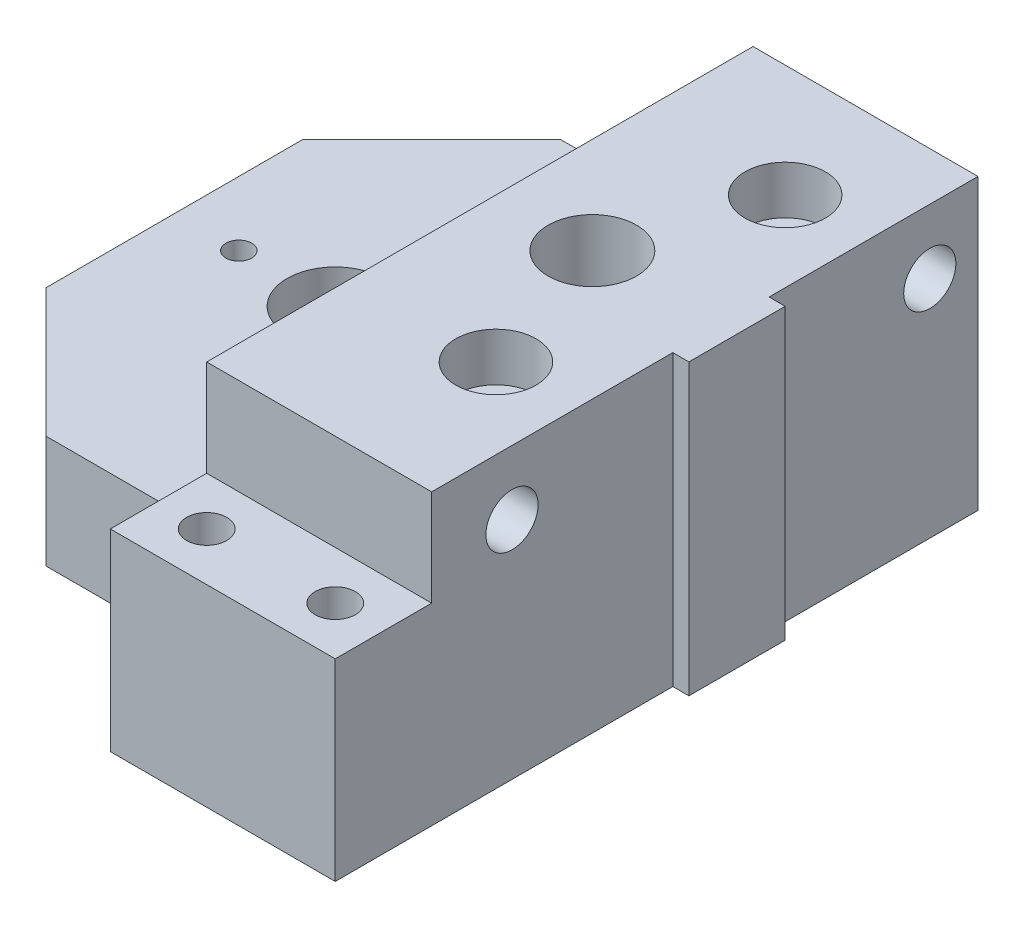
ISO-10303-21;
HEADER;
FILE_DESCRIPTION(('STEP AP214'),'2;1');
FILE_NAME('part.step','',(''),(''),'','','');
FILE_SCHEMA(('AUTOMOTIVE_DESIGN { 1 0 10303 214 1 1 1 1 }'));
ENDSEC;
DATA;
#1=APPLICATION_CONTEXT('core data for automotive mechanical design processes');
#2=APPLICATION_PROTOCOL_DEFINITION('international standard','automotive_design',2000,#1);
#3=PRODUCT_CONTEXT('',#1,'mechanical');
#4=PRODUCT('Part','Part','',(#3));
#5=PRODUCT_RELATED_PRODUCT_CATEGORY('part','',(#4));
#6=PRODUCT_DEFINITION_FORMATION('','',#4);
#7=PRODUCT_DEFINITION_CONTEXT('part definition',#1,'design');
#8=PRODUCT_DEFINITION('design','',#6,#7);
#9=PRODUCT_DEFINITION_SHAPE('','',#8);
#10=(LENGTH_UNIT() NAMED_UNIT(*) SI_UNIT(.MILLI.,.METRE.));
#11=(NAMED_UNIT(*) PLANE_ANGLE_UNIT() SI_UNIT($,.RADIAN.));
#12=(NAMED_UNIT(*) SI_UNIT($,.STERADIAN.) SOLID_ANGLE_UNIT());
#13=UNCERTAINTY_MEASURE_WITH_UNIT(LENGTH_MEASURE(1.E-05),#10,'distance_accuracy_value','');
#14=(GEOMETRIC_REPRESENTATION_CONTEXT(3) GLOBAL_UNCERTAINTY_ASSIGNED_CONTEXT((#13)) GLOBAL_UNIT_ASSIGNED_CONTEXT((#10,
#11,#12)) REPRESENTATION_CONTEXT('',''));
#15=CARTESIAN_POINT('',(0.,0.,0.));
#16=DIRECTION('',(0.,0.,1.));
#17=DIRECTION('',(1.,0.,0.));
#18=AXIS2_PLACEMENT_3D('',#15,#16,#17);
#19=CARTESIAN_POINT('',(60.325,-11.1125,-28.575));
#20=DIRECTION('',(0.,1.,0.));
#21=DIRECTION('',(0.,0.,1.));
#22=AXIS2_PLACEMENT_3D('',#19,#20,#21);
#23=CYLINDRICAL_SURFACE('',#22,5.15620000000001);
#24=CARTESIAN_POINT('',(60.325,-11.1125,-28.575));
#25=DIRECTION('',(0.,1.,0.));
#26=DIRECTION('',(0.,0.,1.));
#27=AXIS2_PLACEMENT_3D('',#24,#25,#26);
#28=CIRCLE('',#27,5.15620000000001);
#29=CARTESIAN_POINT('',(60.325,-11.1125,-23.4188));
#30=VERTEX_POINT('',#29);
#31=EDGE_CURVE('E255',#30,#30,#28,.T.);
#32=ORIENTED_EDGE('',*,*,#31,.F.);
#33=EDGE_LOOP('',(#32));
#34=FACE_BOUND('',#33,.T.);
#35=CARTESIAN_POINT('',(60.325,36.5125,-28.575));
#36=DIRECTION('',(0.,1.,0.));
#37=DIRECTION('',(0.,0.,1.));
#38=AXIS2_PLACEMENT_3D('',#35,#36,#37);
#39=CIRCLE('',#38,5.15620000000001);
#40=CARTESIAN_POINT('',(60.325,36.5125,-23.4188));
#41=VERTEX_POINT('',#40);
#42=EDGE_CURVE('E251',#41,#41,#39,.F.);
#43=ORIENTED_EDGE('',*,*,#42,.F.);
#44=EDGE_LOOP('',(#43));
#45=FACE_BOUND('',#44,.T.);
#46=ADVANCED_FACE('F39',(#34,#45),#23,.F.);
#47=CARTESIAN_POINT('',(60.325,-11.1125,28.575));
#48=DIRECTION('',(0.,1.,0.));
#49=DIRECTION('',(0.,0.,1.));
#50=AXIS2_PLACEMENT_3D('',#47,#48,#49);
#51=CYLINDRICAL_SURFACE('',#50,5.15620000000001);
#52=CARTESIAN_POINT('',(60.325,-11.1125,28.575));
#53=DIRECTION('',(0.,1.,0.));
#54=DIRECTION('',(0.,0.,1.));
#55=AXIS2_PLACEMENT_3D('',#52,#53,#54);
#56=CIRCLE('',#55,5.15620000000001);
#57=CARTESIAN_POINT('',(60.325,-11.1125,33.7312));
#58=VERTEX_POINT('',#57);
#59=EDGE_CURVE('E292',#58,#58,#56,.T.);
#60=ORIENTED_EDGE('',*,*,#59,.F.);
#61=EDGE_LOOP('',(#60));
#62=FACE_BOUND('',#61,.T.);
#63=CARTESIAN_POINT('',(60.325,36.5125,28.575));
#64=DIRECTION('',(0.,1.,0.));
#65=DIRECTION('',(0.,0.,1.));
#66=AXIS2_PLACEMENT_3D('',#63,#64,#65);
#67=CIRCLE('',#66,5.15620000000001);
#68=CARTESIAN_POINT('',(60.325,36.5125,33.7312));
#69=VERTEX_POINT('',#68);
#70=EDGE_CURVE('E248',#69,#69,#67,.F.);
#71=ORIENTED_EDGE('',*,*,#70,.F.);
#72=EDGE_LOOP('',(#71));
#73=FACE_BOUND('',#72,.T.);
#74=ADVANCED_FACE('F418',(#62,#73),#51,.F.);
#75=CARTESIAN_POINT('',(76.2,26.9875,76.2));
#76=DIRECTION('',(-1.,0.,0.));
#77=DIRECTION('',(0.,0.,1.));
#78=AXIS2_PLACEMENT_3D('',#75,#76,#77);
#79=PLANE('',#78);
#80=CARTESIAN_POINT('',(76.2,33.3375,41.275));
#81=DIRECTION('',(-1.,0.,0.));
#82=DIRECTION('',(0.,0.,1.));
#83=AXIS2_PLACEMENT_3D('',#80,#81,#82);
#84=CIRCLE('',#83,5.1562);
#85=CARTESIAN_POINT('',(76.2,33.3375,46.4312));
#86=VERTEX_POINT('',#85);
#87=EDGE_CURVE('E258',#86,#86,#84,.F.);
#88=ORIENTED_EDGE('',*,*,#87,.F.);
#89=EDGE_LOOP('',(#88));
#90=FACE_BOUND('',#89,.T.);
#91=DIRECTION('',(0.,-1.,0.));
#92=VECTOR('',#91,1.);
#93=CARTESIAN_POINT('',(76.2,46.0375,9.4996));
#94=LINE('',#93,#92);
#95=CARTESIAN_POINT('',(76.2,46.0375,9.4996));
#96=VERTEX_POINT('',#95);
#97=CARTESIAN_POINT('',(76.2,-11.1125,9.4996));
#98=VERTEX_POINT('',#97);
#99=EDGE_CURVE('E153',#96,#98,#94,.T.);
#100=ORIENTED_EDGE('',*,*,#99,.F.);
#101=DIRECTION('',(0.,0.,-1.));
#102=VECTOR('',#101,1.);
#103=CARTESIAN_POINT('',(76.2,46.0375,57.15));
#104=LINE('',#103,#102);
#105=CARTESIAN_POINT('',(76.2,46.0375,57.15));
#106=VERTEX_POINT('',#105);
#107=EDGE_CURVE('E166',#106,#96,#104,.T.);
#108=ORIENTED_EDGE('',*,*,#107,.F.);
#109=DIRECTION('',(0.,-1.,0.));
#110=VECTOR('',#109,1.);
#111=CARTESIAN_POINT('',(76.2,46.0375,57.15));
#112=LINE('',#111,#110);
#113=CARTESIAN_POINT('',(76.2,26.9875,57.15));
#114=VERTEX_POINT('',#113);
#115=EDGE_CURVE('E179',#106,#114,#112,.T.);
#116=ORIENTED_EDGE('',*,*,#115,.T.);
#117=DIRECTION('',(0.,0.,-1.));
#118=VECTOR('',#117,1.);
#119=CARTESIAN_POINT('',(76.2,26.9875,76.2));
#120=LINE('',#119,#118);
#121=CARTESIAN_POINT('',(76.2,26.9875,76.2));
#122=VERTEX_POINT('',#121);
#123=EDGE_CURVE('E195',#122,#114,#120,.T.);
#124=ORIENTED_EDGE('',*,*,#123,.F.);
#125=DIRECTION('',(0.,-1.,0.));
#126=VECTOR('',#125,1.);
#127=CARTESIAN_POINT('',(76.2,26.9875,76.2));
#128=LINE('',#127,#126);
#129=CARTESIAN_POINT('',(76.2,-11.1125,76.2));
#130=VERTEX_POINT('',#129);
#131=EDGE_CURVE('E208',#122,#130,#128,.T.);
#132=ORIENTED_EDGE('',*,*,#131,.T.);
#133=DIRECTION('',(0.,0.,-1.));
#134=VECTOR('',#133,1.);
#135=CARTESIAN_POINT('',(76.2,-11.1125,76.2));
#136=LINE('',#135,#134);
#137=EDGE_CURVE('E169',#130,#98,#136,.T.);
#138=ORIENTED_EDGE('',*,*,#137,.T.);
#139=EDGE_LOOP('',(#100,#108,#116,#124,#132,#138));
#140=FACE_BOUND('',#139,.T.);
#141=ADVANCED_FACE('F164',(#90,#140),#79,.F.);
#142=CARTESIAN_POINT('',(0.,26.9875,0.));
#143=DIRECTION('',(0.,-1.,0.));
#144=DIRECTION('',(0.,0.,-1.));
#145=AXIS2_PLACEMENT_3D('',#142,#143,#144);
#146=PLANE('',#145);
#147=CARTESIAN_POINT('',(41.275,26.9875,66.675));
#148=DIRECTION('',(0.,1.,0.));
#149=DIRECTION('',(0.,0.,1.));
#150=AXIS2_PLACEMENT_3D('',#147,#148,#149);
#151=CIRCLE('',#150,3.96875);
#152=CARTESIAN_POINT('',(41.275,26.9875,70.64375));
#153=VERTEX_POINT('',#152);
#154=EDGE_CURVE('E302',#153,#153,#151,.T.);
#155=ORIENTED_EDGE('',*,*,#154,.F.);
#156=EDGE_LOOP('',(#155));
#157=FACE_BOUND('',#156,.T.);
#158=CARTESIAN_POINT('',(66.675,26.9875,66.675));
#159=DIRECTION('',(0.,1.,0.));
#160=DIRECTION('',(0.,0.,1.));
#161=AXIS2_PLACEMENT_3D('',#158,#159,#160);
#162=CIRCLE('',#161,3.96875000000001);
#163=CARTESIAN_POINT('',(66.675,26.9875,70.64375));
#164=VERTEX_POINT('',#163);
#165=EDGE_CURVE('E305',#164,#164,#162,.T.);
#166=ORIENTED_EDGE('',*,*,#165,.F.);
#167=EDGE_LOOP('',(#166));
#168=FACE_BOUND('',#167,.T.);
#169=DIRECTION('',(1.,0.,0.));
#170=VECTOR('',#169,1.);
#171=CARTESIAN_POINT('',(31.75,26.9875,57.15));
#172=LINE('',#171,#170);
#173=CARTESIAN_POINT('',(31.75,26.9875,57.15));
#174=VERTEX_POINT('',#173);
#175=EDGE_CURVE('E64',#174,#114,#172,.T.);
#176=ORIENTED_EDGE('',*,*,#175,.F.);
#177=DIRECTION('',(0.,0.,1.));
#178=VECTOR('',#177,1.);
#179=CARTESIAN_POINT('',(31.75,26.9875,76.2));
#180=LINE('',#179,#178);
#181=CARTESIAN_POINT('',(31.75,26.9875,76.2));
#182=VERTEX_POINT('',#181);
#183=EDGE_CURVE('E191',#174,#182,#180,.T.);
#184=ORIENTED_EDGE('',*,*,#183,.T.);
#185=DIRECTION('',(1.,0.,0.));
#186=VECTOR('',#185,1.);
#187=CARTESIAN_POINT('',(31.75,26.9875,76.2));
#188=LINE('',#187,#186);
#189=EDGE_CURVE('E193',#182,#122,#188,.T.);
#190=ORIENTED_EDGE('',*,*,#189,.T.);
#191=ORIENTED_EDGE('',*,*,#123,.T.);
#192=EDGE_LOOP('',(#176,#184,#190,#191));
#193=FACE_BOUND('',#192,.T.);
#194=ADVANCED_FACE('F362',(#157,#168,#193),#146,.F.);
#195=CARTESIAN_POINT('',(-31.75,11.1125,-25.4));
#196=DIRECTION('',(1.,0.,0.));
#197=DIRECTION('',(0.,0.,-1.));
#198=AXIS2_PLACEMENT_3D('',#195,#196,#197);
#199=PLANE('',#198);
#200=DIRECTION('',(0.,0.,1.));
#201=VECTOR('',#200,1.);
#202=CARTESIAN_POINT('',(-31.75,-11.1125,-25.4));
#203=LINE('',#202,#201);
#204=CARTESIAN_POINT('',(-31.75,-11.1125,-25.4));
#205=VERTEX_POINT('',#204);
#206=CARTESIAN_POINT('',(-31.75,-11.1125,25.4));
#207=VERTEX_POINT('',#206);
#208=EDGE_CURVE('E213',#205,#207,#203,.T.);
#209=ORIENTED_EDGE('',*,*,#208,.T.);
#210=DIRECTION('',(0.,-1.,0.));
#211=VECTOR('',#210,1.);
#212=CARTESIAN_POINT('',(-31.75,11.1125,25.4));
#213=LINE('',#212,#211);
#214=CARTESIAN_POINT('',(-31.75,11.1125,25.4));
#215=VERTEX_POINT('',#214);
#216=EDGE_CURVE('E11',#215,#207,#213,.T.);
#217=ORIENTED_EDGE('',*,*,#216,.F.);
#218=DIRECTION('',(0.,0.,1.));
#219=VECTOR('',#218,1.);
#220=CARTESIAN_POINT('',(-31.75,11.1125,-25.4));
#221=LINE('',#220,#219);
#222=CARTESIAN_POINT('',(-31.75,11.1125,-25.4));
#223=VERTEX_POINT('',#222);
#224=EDGE_CURVE('E214',#223,#215,#221,.T.);
#225=ORIENTED_EDGE('',*,*,#224,.F.);
#226=DIRECTION('',(0.,-1.,0.));
#227=VECTOR('',#226,1.);
#228=CARTESIAN_POINT('',(-31.75,11.1125,-25.4));
#229=LINE('',#228,#227);
#230=EDGE_CURVE('E228',#223,#205,#229,.T.);
#231=ORIENTED_EDGE('',*,*,#230,.T.);
#232=EDGE_LOOP('',(#209,#217,#225,#231));
#233=FACE_BOUND('',#232,.T.);
#234=ADVANCED_FACE('F41',(#233),#199,.F.);
#235=CARTESIAN_POINT('',(-31.75,11.1125,25.4));
#236=DIRECTION('',(0.707106781186547,0.,-0.707106781186547));
#237=DIRECTION('',(-0.707106781186548,0.,-0.707106781186548));
#238=AXIS2_PLACEMENT_3D('',#235,#236,#237);
#239=PLANE('',#238);
#240=DIRECTION('',(0.707106781186547,0.,0.707106781186547));
#241=VECTOR('',#240,1.);
#242=CARTESIAN_POINT('',(-31.75,-11.1125,25.4));
#243=LINE('',#242,#241);
#244=CARTESIAN_POINT('',(-6.35,-11.1125,50.8));
#245=VERTEX_POINT('',#244);
#246=EDGE_CURVE('E231',#207,#245,#243,.T.);
#247=ORIENTED_EDGE('',*,*,#246,.T.);
#248=DIRECTION('',(0.,-1.,0.));
#249=VECTOR('',#248,1.);
#250=CARTESIAN_POINT('',(-6.35,11.1125,50.8));
#251=LINE('',#250,#249);
#252=CARTESIAN_POINT('',(-6.35,11.1125,50.8));
#253=VERTEX_POINT('',#252);
#254=EDGE_CURVE('E48',#253,#245,#251,.T.);
#255=ORIENTED_EDGE('',*,*,#254,.F.);
#256=DIRECTION('',(0.707106781186547,0.,0.707106781186547));
#257=VECTOR('',#256,1.);
#258=CARTESIAN_POINT('',(-31.75,11.1125,25.4));
#259=LINE('',#258,#257);
#260=EDGE_CURVE('E217',#215,#253,#259,.T.);
#261=ORIENTED_EDGE('',*,*,#260,.F.);
#262=ORIENTED_EDGE('',*,*,#216,.T.);
#263=EDGE_LOOP('',(#247,#255,#261,#262));
#264=FACE_BOUND('',#263,.T.);
#265=ADVANCED_FACE('F398',(#264),#239,.F.);
#266=CARTESIAN_POINT('',(-6.35,11.1125,50.8));
#267=DIRECTION('',(0.,0.,-1.));
#268=DIRECTION('',(-1.,0.,0.));
#269=AXIS2_PLACEMENT_3D('',#266,#267,#268);
#270=PLANE('',#269);
#271=DIRECTION('',(1.,0.,0.));
#272=VECTOR('',#271,1.);
#273=CARTESIAN_POINT('',(-6.35,-11.1125,50.8));
#274=LINE('',#273,#272);
#275=CARTESIAN_POINT('',(31.75,-11.1125,50.8));
#276=VERTEX_POINT('',#275);
#277=EDGE_CURVE('E233',#245,#276,#274,.T.);
#278=ORIENTED_EDGE('',*,*,#277,.T.);
#279=DIRECTION('',(0.,-1.,0.));
#280=VECTOR('',#279,1.);
#281=CARTESIAN_POINT('',(31.75,11.1125,50.8));
#282=LINE('',#281,#280);
#283=CARTESIAN_POINT('',(31.75,11.1125,50.8));
#284=VERTEX_POINT('',#283);
#285=EDGE_CURVE('E243',#284,#276,#282,.T.);
#286=ORIENTED_EDGE('',*,*,#285,.F.);
#287=DIRECTION('',(1.,0.,0.));
#288=VECTOR('',#287,1.);
#289=CARTESIAN_POINT('',(-6.35,11.1125,50.8));
#290=LINE('',#289,#288);
#291=EDGE_CURVE('E220',#253,#284,#290,.T.);
#292=ORIENTED_EDGE('',*,*,#291,.F.);
#293=ORIENTED_EDGE('',*,*,#254,.T.);
#294=EDGE_LOOP('',(#278,#286,#292,#293));
#295=FACE_BOUND('',#294,.T.);
#296=ADVANCED_FACE('F394',(#295),#270,.F.);
#297=CARTESIAN_POINT('',(31.75,11.1125,-50.8));
#298=DIRECTION('',(0.,0.,1.));
#299=DIRECTION('',(1.,0.,0.));
#300=AXIS2_PLACEMENT_3D('',#297,#298,#299);
#301=PLANE('',#300);
#302=DIRECTION('',(-1.,0.,0.));
#303=VECTOR('',#302,1.);
#304=CARTESIAN_POINT('',(31.75,-11.1125,-50.8));
#305=LINE('',#304,#303);
#306=CARTESIAN_POINT('',(76.2,-11.1125,-50.8));
#307=VERTEX_POINT('',#306);
#308=CARTESIAN_POINT('',(-6.35,-11.1125,-50.8));
#309=VERTEX_POINT('',#308);
#310=EDGE_CURVE('E235',#307,#309,#305,.T.);
#311=ORIENTED_EDGE('',*,*,#310,.T.);
#312=DIRECTION('',(0.,-1.,0.));
#313=VECTOR('',#312,1.);
#314=CARTESIAN_POINT('',(-6.35,11.1125,-50.8));
#315=LINE('',#314,#313);
#316=CARTESIAN_POINT('',(-6.35,11.1125,-50.8));
#317=VERTEX_POINT('',#316);
#318=EDGE_CURVE('E240',#317,#309,#315,.T.);
#319=ORIENTED_EDGE('',*,*,#318,.F.);
#320=DIRECTION('',(-1.,0.,0.));
#321=VECTOR('',#320,1.);
#322=CARTESIAN_POINT('',(31.75,11.1125,-50.8));
#323=LINE('',#322,#321);
#324=CARTESIAN_POINT('',(31.75,11.1125,-50.8));
#325=VERTEX_POINT('',#324);
#326=EDGE_CURVE('E224',#325,#317,#323,.T.);
#327=ORIENTED_EDGE('',*,*,#326,.F.);
#328=DIRECTION('',(0.,-1.,0.));
#329=VECTOR('',#328,1.);
#330=CARTESIAN_POINT('',(31.75,26.9875,-50.8));
#331=LINE('',#330,#329);
#332=CARTESIAN_POINT('',(31.75,46.0375,-50.8));
#333=VERTEX_POINT('',#332);
#334=EDGE_CURVE('E197',#333,#325,#331,.T.);
#335=ORIENTED_EDGE('',*,*,#334,.F.);
#336=DIRECTION('',(-1.,0.,0.));
#337=VECTOR('',#336,1.);
#338=CARTESIAN_POINT('',(31.75,46.0375,-50.8));
#339=LINE('',#338,#337);
#340=CARTESIAN_POINT('',(76.2,46.0375,-50.8));
#341=VERTEX_POINT('',#340);
#342=EDGE_CURVE('E175',#341,#333,#339,.T.);
#343=ORIENTED_EDGE('',*,*,#342,.F.);
#344=DIRECTION('',(0.,-1.,0.));
#345=VECTOR('',#344,1.);
#346=CARTESIAN_POINT('',(76.2,26.9875,-50.8));
#347=LINE('',#346,#345);
#348=EDGE_CURVE('E205',#341,#307,#347,.T.);
#349=ORIENTED_EDGE('',*,*,#348,.T.);
#350=EDGE_LOOP('',(#311,#319,#327,#335,#343,#349));
#351=FACE_BOUND('',#350,.T.);
#352=ADVANCED_FACE('F385',(#351),#301,.F.);
#353=CARTESIAN_POINT('',(-6.35,11.1125,-50.8));
#354=DIRECTION('',(0.707106781186547,0.,0.707106781186547));
#355=DIRECTION('',(0.707106781186548,0.,-0.707106781186548));
#356=AXIS2_PLACEMENT_3D('',#353,#354,#355);
#357=PLANE('',#356);
#358=DIRECTION('',(-0.707106781186547,0.,0.707106781186547));
#359=VECTOR('',#358,1.);
#360=CARTESIAN_POINT('',(-6.35,-11.1125,-50.8));
#361=LINE('',#360,#359);
#362=EDGE_CURVE('E218',#309,#205,#361,.T.);
#363=ORIENTED_EDGE('',*,*,#362,.T.);
#364=ORIENTED_EDGE('',*,*,#230,.F.);
#365=DIRECTION('',(-0.707106781186547,0.,0.707106781186547));
#366=VECTOR('',#365,1.);
#367=CARTESIAN_POINT('',(-6.35,11.1125,-50.8));
#368=LINE('',#367,#366);
#369=EDGE_CURVE('E226',#317,#223,#368,.T.);
#370=ORIENTED_EDGE('',*,*,#369,.F.);
#371=ORIENTED_EDGE('',*,*,#318,.T.);
#372=EDGE_LOOP('',(#363,#364,#370,#371));
#373=FACE_BOUND('',#372,.T.);
#374=ADVANCED_FACE('F404',(#373),#357,.F.);
#375=CARTESIAN_POINT('',(0.,11.1125,0.));
#376=DIRECTION('',(0.,1.,0.));
#377=DIRECTION('',(0.,0.,1.));
#378=AXIS2_PLACEMENT_3D('',#375,#376,#377);
#379=PLANE('',#378);
#380=CARTESIAN_POINT('',(9.525,11.1125,-16.51));
#381=DIRECTION('',(0.,1.,0.));
#382=DIRECTION('',(0.,0.,1.));
#383=AXIS2_PLACEMENT_3D('',#380,#381,#382);
#384=CIRCLE('',#383,2.5527);
#385=CARTESIAN_POINT('',(9.525,11.1125,-13.9573));
#386=VERTEX_POINT('',#385);
#387=EDGE_CURVE('E313',#386,#386,#384,.T.);
#388=ORIENTED_EDGE('',*,*,#387,.F.);
#389=EDGE_LOOP('',(#388));
#390=FACE_BOUND('',#389,.T.);
#391=CARTESIAN_POINT('',(-19.05,11.1125,0.));
#392=DIRECTION('',(0.,1.,0.));
#393=DIRECTION('',(0.,0.,1.));
#394=AXIS2_PLACEMENT_3D('',#391,#392,#393);
#395=CIRCLE('',#394,2.5527);
#396=CARTESIAN_POINT('',(-19.05,11.1125,2.5527));
#397=VERTEX_POINT('',#396);
#398=EDGE_CURVE('E326',#397,#397,#395,.T.);
#399=ORIENTED_EDGE('',*,*,#398,.F.);
#400=EDGE_LOOP('',(#399));
#401=FACE_BOUND('',#400,.T.);
#402=CARTESIAN_POINT('',(9.525,11.1125,16.51));
#403=DIRECTION('',(0.,1.,0.));
#404=DIRECTION('',(0.,0.,1.));
#405=AXIS2_PLACEMENT_3D('',#402,#403,#404);
#406=CIRCLE('',#405,2.5527);
#407=CARTESIAN_POINT('',(9.525,11.1125,19.0627));
#408=VERTEX_POINT('',#407);
#409=EDGE_CURVE('E329',#408,#408,#406,.T.);
#410=ORIENTED_EDGE('',*,*,#409,.F.);
#411=EDGE_LOOP('',(#410));
#412=FACE_BOUND('',#411,.T.);
#413=CARTESIAN_POINT('',(0.,11.1125,0.));
#414=DIRECTION('',(0.,1.,0.));
#415=DIRECTION('',(0.,0.,1.));
#416=AXIS2_PLACEMENT_3D('',#413,#414,#415);
#417=CIRCLE('',#416,9.525);
#418=CARTESIAN_POINT('',(0.,11.1125,9.525));
#419=VERTEX_POINT('',#418);
#420=EDGE_CURVE('E325',#419,#419,#417,.T.);
#421=ORIENTED_EDGE('',*,*,#420,.F.);
#422=EDGE_LOOP('',(#421));
#423=FACE_BOUND('',#422,.T.);
#424=ORIENTED_EDGE('',*,*,#224,.T.);
#425=ORIENTED_EDGE('',*,*,#260,.T.);
#426=ORIENTED_EDGE('',*,*,#291,.T.);
#427=DIRECTION('',(0.,0.,-1.));
#428=VECTOR('',#427,1.);
#429=CARTESIAN_POINT('',(31.75,11.1125,50.8));
#430=LINE('',#429,#428);
#431=EDGE_CURVE('E222',#284,#325,#430,.T.);
#432=ORIENTED_EDGE('',*,*,#431,.T.);
#433=ORIENTED_EDGE('',*,*,#326,.T.);
#434=ORIENTED_EDGE('',*,*,#369,.T.);
#435=EDGE_LOOP('',(#424,#425,#426,#432,#433,#434));
#436=FACE_BOUND('',#435,.T.);
#437=ADVANCED_FACE('F390',(#390,#401,#412,#423,#436),#379,.T.);
#438=CARTESIAN_POINT('',(0.,-11.1125,0.));
#439=DIRECTION('',(0.,1.,0.));
#440=DIRECTION('',(0.,0.,1.));
#441=AXIS2_PLACEMENT_3D('',#438,#439,#440);
#442=PLANE('',#441);
#443=ORIENTED_EDGE('',*,*,#59,.T.);
#444=EDGE_LOOP('',(#443));
#445=FACE_BOUND('',#444,.T.);
#446=ORIENTED_EDGE('',*,*,#31,.T.);
#447=EDGE_LOOP('',(#446));
#448=FACE_BOUND('',#447,.T.);
#449=CARTESIAN_POINT('',(0.,-11.1125,0.));
#450=DIRECTION('',(0.,1.,0.));
#451=DIRECTION('',(0.,0.,1.));
#452=AXIS2_PLACEMENT_3D('',#449,#450,#451);
#453=CIRCLE('',#452,9.525);
#454=CARTESIAN_POINT('',(0.,-11.1125,9.525));
#455=VERTEX_POINT('',#454);
#456=EDGE_CURVE('E334',#455,#455,#453,.T.);
#457=ORIENTED_EDGE('',*,*,#456,.T.);
#458=EDGE_LOOP('',(#457));
#459=FACE_BOUND('',#458,.T.);
#460=ORIENTED_EDGE('',*,*,#208,.F.);
#461=ORIENTED_EDGE('',*,*,#362,.F.);
#462=ORIENTED_EDGE('',*,*,#310,.F.);
#463=CARTESIAN_POINT('',(76.2,-11.1125,-9.52500000000001));
#464=VERTEX_POINT('',#463);
#465=EDGE_CURVE('E201',#464,#307,#136,.T.);
#466=ORIENTED_EDGE('',*,*,#465,.F.);
#467=DIRECTION('',(-1.,0.,0.));
#468=VECTOR('',#467,1.);
#469=CARTESIAN_POINT('',(76.2,-11.1125,-9.525));
#470=LINE('',#469,#468);
#471=CARTESIAN_POINT('',(79.375,-11.1125,-9.525));
#472=VERTEX_POINT('',#471);
#473=EDGE_CURVE('E56',#472,#464,#470,.T.);
#474=ORIENTED_EDGE('',*,*,#473,.F.);
#475=DIRECTION('',(0.,0.,-1.));
#476=VECTOR('',#475,1.);
#477=CARTESIAN_POINT('',(79.375,-11.1125,9.4996));
#478=LINE('',#477,#476);
#479=CARTESIAN_POINT('',(79.375,-11.1125,9.4996));
#480=VERTEX_POINT('',#479);
#481=EDGE_CURVE('E345',#480,#472,#478,.T.);
#482=ORIENTED_EDGE('',*,*,#481,.F.);
#483=DIRECTION('',(1.,0.,0.));
#484=VECTOR('',#483,1.);
#485=CARTESIAN_POINT('',(76.2,-11.1125,9.4996));
#486=LINE('',#485,#484);
#487=EDGE_CURVE('E337',#98,#480,#486,.T.);
#488=ORIENTED_EDGE('',*,*,#487,.F.);
#489=ORIENTED_EDGE('',*,*,#137,.F.);
#490=DIRECTION('',(1.,0.,0.));
#491=VECTOR('',#490,1.);
#492=CARTESIAN_POINT('',(31.75,-11.1125,76.2));
#493=LINE('',#492,#491);
#494=CARTESIAN_POINT('',(31.75,-11.1125,76.2));
#495=VERTEX_POINT('',#494);
#496=EDGE_CURVE('E199',#495,#130,#493,.T.);
#497=ORIENTED_EDGE('',*,*,#496,.F.);
#498=DIRECTION('',(0.,0.,1.));
#499=VECTOR('',#498,1.);
#500=CARTESIAN_POINT('',(31.75,-11.1125,76.2));
#501=LINE('',#500,#499);
#502=EDGE_CURVE('E190',#276,#495,#501,.T.);
#503=ORIENTED_EDGE('',*,*,#502,.F.);
#504=ORIENTED_EDGE('',*,*,#277,.F.);
#505=ORIENTED_EDGE('',*,*,#246,.F.);
#506=EDGE_LOOP('',(#460,#461,#462,#466,#474,#482,#488,#489,#497,#503,#504,#505));
#507=FACE_BOUND('',#506,.T.);
#508=ADVANCED_FACE('F370',(#445,#448,#459,#507),#442,.F.);
#509=CARTESIAN_POINT('',(31.75,26.9875,76.2));
#510=DIRECTION('',(1.,0.,0.));
#511=DIRECTION('',(0.,0.,-1.));
#512=AXIS2_PLACEMENT_3D('',#509,#510,#511);
#513=PLANE('',#512);
#514=CARTESIAN_POINT('',(31.75,33.3375,41.275));
#515=DIRECTION('',(1.,0.,0.));
#516=DIRECTION('',(0.,0.,-1.));
#517=AXIS2_PLACEMENT_3D('',#514,#515,#516);
#518=CIRCLE('',#517,7.9375);
#519=CARTESIAN_POINT('',(31.75,33.3375,33.3375));
#520=VERTEX_POINT('',#519);
#521=EDGE_CURVE('E266',#520,#520,#518,.T.);
#522=ORIENTED_EDGE('',*,*,#521,.T.);
#523=EDGE_LOOP('',(#522));
#524=FACE_BOUND('',#523,.T.);
#525=CARTESIAN_POINT('',(31.75,33.3375,-41.275));
#526=DIRECTION('',(1.,0.,0.));
#527=DIRECTION('',(0.,0.,-1.));
#528=AXIS2_PLACEMENT_3D('',#525,#526,#527);
#529=CIRCLE('',#528,7.9375);
#530=CARTESIAN_POINT('',(31.75,33.3375,-49.2125));
#531=VERTEX_POINT('',#530);
#532=EDGE_CURVE('E271',#531,#531,#529,.T.);
#533=ORIENTED_EDGE('',*,*,#532,.T.);
#534=EDGE_LOOP('',(#533));
#535=FACE_BOUND('',#534,.T.);
#536=ORIENTED_EDGE('',*,*,#431,.F.);
#537=ORIENTED_EDGE('',*,*,#285,.T.);
#538=ORIENTED_EDGE('',*,*,#502,.T.);
#539=DIRECTION('',(0.,-1.,0.));
#540=VECTOR('',#539,1.);
#541=CARTESIAN_POINT('',(31.75,26.9875,76.2));
#542=LINE('',#541,#540);
#543=EDGE_CURVE('E210',#182,#495,#542,.T.);
#544=ORIENTED_EDGE('',*,*,#543,.F.);
#545=ORIENTED_EDGE('',*,*,#183,.F.);
#546=DIRECTION('',(0.,-1.,0.));
#547=VECTOR('',#546,1.);
#548=CARTESIAN_POINT('',(31.75,46.0375,57.15));
#549=LINE('',#548,#547);
#550=CARTESIAN_POINT('',(31.75,46.0375,57.15));
#551=VERTEX_POINT('',#550);
#552=EDGE_CURVE('E187',#551,#174,#549,.T.);
#553=ORIENTED_EDGE('',*,*,#552,.F.);
#554=DIRECTION('',(0.,0.,1.));
#555=VECTOR('',#554,1.);
#556=CARTESIAN_POINT('',(31.75,46.0375,57.15));
#557=LINE('',#556,#555);
#558=EDGE_CURVE('E185',#333,#551,#557,.T.);
#559=ORIENTED_EDGE('',*,*,#558,.F.);
#560=ORIENTED_EDGE('',*,*,#334,.T.);
#561=EDGE_LOOP('',(#536,#537,#538,#544,#545,#553,#559,#560));
#562=FACE_BOUND('',#561,.T.);
#563=ADVANCED_FACE('F356',(#524,#535,#562),#513,.F.);
#564=CARTESIAN_POINT('',(31.75,26.9875,76.2));
#565=DIRECTION('',(0.,0.,-1.));
#566=DIRECTION('',(-1.,0.,0.));
#567=AXIS2_PLACEMENT_3D('',#564,#565,#566);
#568=PLANE('',#567);
#569=ORIENTED_EDGE('',*,*,#496,.T.);
#570=ORIENTED_EDGE('',*,*,#131,.F.);
#571=ORIENTED_EDGE('',*,*,#189,.F.);
#572=ORIENTED_EDGE('',*,*,#543,.T.);
#573=EDGE_LOOP('',(#569,#570,#571,#572));
#574=FACE_BOUND('',#573,.T.);
#575=ADVANCED_FACE('F365',(#574),#568,.F.);
#576=CARTESIAN_POINT('',(76.2,33.3375,-41.275));
#577=DIRECTION('',(-1.,0.,0.));
#578=DIRECTION('',(0.,0.,1.));
#579=AXIS2_PLACEMENT_3D('',#576,#577,#578);
#580=CIRCLE('',#579,5.1562);
#581=CARTESIAN_POINT('',(76.2,33.3375,-36.1188));
#582=VERTEX_POINT('',#581);
#583=EDGE_CURVE('E256',#582,#582,#580,.F.);
#584=ORIENTED_EDGE('',*,*,#583,.F.);
#585=EDGE_LOOP('',(#584));
#586=FACE_BOUND('',#585,.T.);
#587=CARTESIAN_POINT('',(76.2,46.0375,-9.525));
#588=VERTEX_POINT('',#587);
#589=EDGE_CURVE('E176',#588,#341,#104,.T.);
#590=ORIENTED_EDGE('',*,*,#589,.F.);
#591=DIRECTION('',(0.,-1.,0.));
#592=VECTOR('',#591,1.);
#593=CARTESIAN_POINT('',(76.2,46.0375,-9.525));
#594=LINE('',#593,#592);
#595=EDGE_CURVE('E343',#588,#464,#594,.T.);
#596=ORIENTED_EDGE('',*,*,#595,.T.);
#597=ORIENTED_EDGE('',*,*,#465,.T.);
#598=ORIENTED_EDGE('',*,*,#348,.F.);
#599=EDGE_LOOP('',(#590,#596,#597,#598));
#600=FACE_BOUND('',#599,.T.);
#601=ADVANCED_FACE('F382',(#586,#600),#79,.F.);
#602=CARTESIAN_POINT('',(31.75,46.0375,57.15));
#603=DIRECTION('',(0.,0.,-1.));
#604=DIRECTION('',(-1.,0.,0.));
#605=AXIS2_PLACEMENT_3D('',#602,#603,#604);
#606=PLANE('',#605);
#607=ORIENTED_EDGE('',*,*,#175,.T.);
#608=ORIENTED_EDGE('',*,*,#115,.F.);
#609=DIRECTION('',(1.,0.,0.));
#610=VECTOR('',#609,1.);
#611=CARTESIAN_POINT('',(31.75,46.0375,57.15));
#612=LINE('',#611,#610);
#613=EDGE_CURVE('E173',#551,#106,#612,.T.);
#614=ORIENTED_EDGE('',*,*,#613,.F.);
#615=ORIENTED_EDGE('',*,*,#552,.T.);
#616=EDGE_LOOP('',(#607,#608,#614,#615));
#617=FACE_BOUND('',#616,.T.);
#618=ADVANCED_FACE('F359',(#617),#606,.F.);
#619=CARTESIAN_POINT('',(0.,46.0375,0.));
#620=DIRECTION('',(0.,-1.,0.));
#621=DIRECTION('',(0.,0.,-1.));
#622=AXIS2_PLACEMENT_3D('',#619,#620,#621);
#623=PLANE('',#622);
#624=CARTESIAN_POINT('',(60.325,46.0375,28.575));
#625=DIRECTION('',(0.,1.,0.));
#626=DIRECTION('',(0.,0.,1.));
#627=AXIS2_PLACEMENT_3D('',#624,#625,#626);
#628=CIRCLE('',#627,7.93750000000001);
#629=CARTESIAN_POINT('',(60.325,46.0375,36.5125));
#630=VERTEX_POINT('',#629);
#631=EDGE_CURVE('E284',#630,#630,#628,.T.);
#632=ORIENTED_EDGE('',*,*,#631,.F.);
#633=EDGE_LOOP('',(#632));
#634=FACE_BOUND('',#633,.T.);
#635=CARTESIAN_POINT('',(60.325,46.0375,-28.575));
#636=DIRECTION('',(0.,1.,0.));
#637=DIRECTION('',(0.,0.,1.));
#638=AXIS2_PLACEMENT_3D('',#635,#636,#637);
#639=CIRCLE('',#638,7.93750000000001);
#640=CARTESIAN_POINT('',(60.325,46.0375,-20.6375));
#641=VERTEX_POINT('',#640);
#642=EDGE_CURVE('E287',#641,#641,#639,.T.);
#643=ORIENTED_EDGE('',*,*,#642,.F.);
#644=EDGE_LOOP('',(#643));
#645=FACE_BOUND('',#644,.T.);
#646=CARTESIAN_POINT('',(50.8,46.0375,0.));
#647=DIRECTION('',(0.,1.,0.));
#648=DIRECTION('',(0.,0.,1.));
#649=AXIS2_PLACEMENT_3D('',#646,#647,#648);
#650=CIRCLE('',#649,8.73125);
#651=CARTESIAN_POINT('',(50.8,46.0375,8.73125));
#652=VERTEX_POINT('',#651);
#653=EDGE_CURVE('E301',#652,#652,#650,.T.);
#654=ORIENTED_EDGE('',*,*,#653,.F.);
#655=EDGE_LOOP('',(#654));
#656=FACE_BOUND('',#655,.T.);
#657=ORIENTED_EDGE('',*,*,#558,.T.);
#658=ORIENTED_EDGE('',*,*,#613,.T.);
#659=ORIENTED_EDGE('',*,*,#107,.T.);
#660=DIRECTION('',(1.,0.,0.));
#661=VECTOR('',#660,1.);
#662=CARTESIAN_POINT('',(76.2,46.0375,9.4996));
#663=LINE('',#662,#661);
#664=CARTESIAN_POINT('',(79.375,46.0375,9.4996));
#665=VERTEX_POINT('',#664);
#666=EDGE_CURVE('E150',#96,#665,#663,.T.);
#667=ORIENTED_EDGE('',*,*,#666,.T.);
#668=DIRECTION('',(0.,0.,-1.));
#669=VECTOR('',#668,1.);
#670=CARTESIAN_POINT('',(79.375,46.0375,9.4996));
#671=LINE('',#670,#669);
#672=CARTESIAN_POINT('',(79.375,46.0375,-9.525));
#673=VERTEX_POINT('',#672);
#674=EDGE_CURVE('E160',#665,#673,#671,.T.);
#675=ORIENTED_EDGE('',*,*,#674,.T.);
#676=DIRECTION('',(-1.,0.,0.));
#677=VECTOR('',#676,1.);
#678=CARTESIAN_POINT('',(76.2,46.0375,-9.525));
#679=LINE('',#678,#677);
#680=EDGE_CURVE('E341',#673,#588,#679,.T.);
#681=ORIENTED_EDGE('',*,*,#680,.T.);
#682=ORIENTED_EDGE('',*,*,#589,.T.);
#683=ORIENTED_EDGE('',*,*,#342,.T.);
#684=EDGE_LOOP('',(#657,#658,#659,#667,#675,#681,#682,#683));
#685=FACE_BOUND('',#684,.T.);
#686=ADVANCED_FACE('F172',(#634,#645,#656,#685),#623,.F.);
#687=CARTESIAN_POINT('',(76.2,46.0375,9.4996));
#688=DIRECTION('',(0.,0.,-1.));
#689=DIRECTION('',(-1.,0.,0.));
#690=AXIS2_PLACEMENT_3D('',#687,#688,#689);
#691=PLANE('',#690);
#692=ORIENTED_EDGE('',*,*,#487,.T.);
#693=DIRECTION('',(0.,-1.,0.));
#694=VECTOR('',#693,1.);
#695=CARTESIAN_POINT('',(79.375,46.0375,9.4996));
#696=LINE('',#695,#694);
#697=EDGE_CURVE('E156',#665,#480,#696,.T.);
#698=ORIENTED_EDGE('',*,*,#697,.F.);
#699=ORIENTED_EDGE('',*,*,#666,.F.);
#700=ORIENTED_EDGE('',*,*,#99,.T.);
#701=EDGE_LOOP('',(#692,#698,#699,#700));
#702=FACE_BOUND('',#701,.T.);
#703=ADVANCED_FACE('F152',(#702),#691,.F.);
#704=CARTESIAN_POINT('',(79.375,46.0375,9.4996));
#705=DIRECTION('',(-1.,0.,0.));
#706=DIRECTION('',(0.,0.,1.));
#707=AXIS2_PLACEMENT_3D('',#704,#705,#706);
#708=PLANE('',#707);
#709=ORIENTED_EDGE('',*,*,#481,.T.);
#710=DIRECTION('',(0.,-1.,0.));
#711=VECTOR('',#710,1.);
#712=CARTESIAN_POINT('',(79.375,46.0375,-9.525));
#713=LINE('',#712,#711);
#714=EDGE_CURVE('E349',#673,#472,#713,.T.);
#715=ORIENTED_EDGE('',*,*,#714,.F.);
#716=ORIENTED_EDGE('',*,*,#674,.F.);
#717=ORIENTED_EDGE('',*,*,#697,.T.);
#718=EDGE_LOOP('',(#709,#715,#716,#717));
#719=FACE_BOUND('',#718,.T.);
#720=ADVANCED_FACE('F374',(#719),#708,.F.);
#721=CARTESIAN_POINT('',(76.2,46.0375,-9.525));
#722=DIRECTION('',(0.,0.,1.));
#723=DIRECTION('',(1.,0.,0.));
#724=AXIS2_PLACEMENT_3D('',#721,#722,#723);
#725=PLANE('',#724);
#726=ORIENTED_EDGE('',*,*,#473,.T.);
#727=ORIENTED_EDGE('',*,*,#595,.F.);
#728=ORIENTED_EDGE('',*,*,#680,.F.);
#729=ORIENTED_EDGE('',*,*,#714,.T.);
#730=EDGE_LOOP('',(#726,#727,#728,#729));
#731=FACE_BOUND('',#730,.T.);
#732=ADVANCED_FACE('F379',(#731),#725,.F.);
#733=CARTESIAN_POINT('',(0.,-11.1125,0.));
#734=DIRECTION('',(0.,1.,0.));
#735=DIRECTION('',(0.,0.,1.));
#736=AXIS2_PLACEMENT_3D('',#733,#734,#735);
#737=CYLINDRICAL_SURFACE('',#736,9.525);
#738=ORIENTED_EDGE('',*,*,#456,.F.);
#739=EDGE_LOOP('',(#738));
#740=FACE_BOUND('',#739,.T.);
#741=ORIENTED_EDGE('',*,*,#420,.T.);
#742=EDGE_LOOP('',(#741));
#743=FACE_BOUND('',#742,.T.);
#744=ADVANCED_FACE('F476',(#740,#743),#737,.F.);
#745=CARTESIAN_POINT('',(9.525,-1.5875,16.51));
#746=DIRECTION('',(0.,1.,0.));
#747=DIRECTION('',(0.,0.,1.));
#748=AXIS2_PLACEMENT_3D('',#745,#746,#747);
#749=CYLINDRICAL_SURFACE('',#748,2.5527);
#750=CARTESIAN_POINT('',(9.525,-1.5875,16.51));
#751=DIRECTION('',(0.,1.,0.));
#752=DIRECTION('',(0.,0.,1.));
#753=AXIS2_PLACEMENT_3D('',#750,#751,#752);
#754=CIRCLE('',#753,2.5527);
#755=CARTESIAN_POINT('',(9.525,-1.5875,19.0627));
#756=VERTEX_POINT('',#755);
#757=EDGE_CURVE('E319',#756,#756,#754,.T.);
#758=ORIENTED_EDGE('',*,*,#757,.F.);
#759=EDGE_LOOP('',(#758));
#760=FACE_BOUND('',#759,.T.);
#761=ORIENTED_EDGE('',*,*,#409,.T.);
#762=EDGE_LOOP('',(#761));
#763=FACE_BOUND('',#762,.T.);
#764=ADVANCED_FACE('F473',(#760,#763),#749,.F.);
#765=CARTESIAN_POINT('',(9.525,-1.5875,16.51));
#766=DIRECTION('',(0.,1.,0.));
#767=DIRECTION('',(0.,0.,1.));
#768=AXIS2_PLACEMENT_3D('',#765,#766,#767);
#769=PLANE('',#768);
#770=ORIENTED_EDGE('',*,*,#757,.T.);
#771=EDGE_LOOP('',(#770));
#772=FACE_BOUND('',#771,.T.);
#773=ADVANCED_FACE('F471',(#772),#769,.T.);
#774=CARTESIAN_POINT('',(-19.05,-1.5875,0.));
#775=DIRECTION('',(0.,1.,0.));
#776=DIRECTION('',(0.,0.,1.));
#777=AXIS2_PLACEMENT_3D('',#774,#775,#776);
#778=CYLINDRICAL_SURFACE('',#777,2.5527);
#779=CARTESIAN_POINT('',(-19.05,-1.5875,0.));
#780=DIRECTION('',(0.,1.,0.));
#781=DIRECTION('',(0.,0.,1.));
#782=AXIS2_PLACEMENT_3D('',#779,#780,#781);
#783=CIRCLE('',#782,2.5527);
#784=CARTESIAN_POINT('',(-19.05,-1.5875,2.5527));
#785=VERTEX_POINT('',#784);
#786=EDGE_CURVE('E322',#785,#785,#783,.T.);
#787=ORIENTED_EDGE('',*,*,#786,.F.);
#788=EDGE_LOOP('',(#787));
#789=FACE_BOUND('',#788,.T.);
#790=ORIENTED_EDGE('',*,*,#398,.T.);
#791=EDGE_LOOP('',(#790));
#792=FACE_BOUND('',#791,.T.);
#793=ADVANCED_FACE('F467',(#789,#792),#778,.F.);
#794=CARTESIAN_POINT('',(-19.05,-1.5875,0.));
#795=DIRECTION('',(0.,1.,0.));
#796=DIRECTION('',(0.,0.,1.));
#797=AXIS2_PLACEMENT_3D('',#794,#795,#796);
#798=PLANE('',#797);
#799=ORIENTED_EDGE('',*,*,#786,.T.);
#800=EDGE_LOOP('',(#799));
#801=FACE_BOUND('',#800,.T.);
#802=ADVANCED_FACE('F463',(#801),#798,.T.);
#803=CARTESIAN_POINT('',(9.525,-1.5875,-16.51));
#804=DIRECTION('',(0.,1.,0.));
#805=DIRECTION('',(0.,0.,1.));
#806=AXIS2_PLACEMENT_3D('',#803,#804,#805);
#807=CYLINDRICAL_SURFACE('',#806,2.5527);
#808=CARTESIAN_POINT('',(9.525,-1.5875,-16.51));
#809=DIRECTION('',(0.,1.,0.));
#810=DIRECTION('',(0.,0.,1.));
#811=AXIS2_PLACEMENT_3D('',#808,#809,#810);
#812=CIRCLE('',#811,2.5527);
#813=CARTESIAN_POINT('',(9.525,-1.5875,-13.9573));
#814=VERTEX_POINT('',#813);
#815=EDGE_CURVE('E316',#814,#814,#812,.T.);
#816=ORIENTED_EDGE('',*,*,#815,.F.);
#817=EDGE_LOOP('',(#816));
#818=FACE_BOUND('',#817,.T.);
#819=ORIENTED_EDGE('',*,*,#387,.T.);
#820=EDGE_LOOP('',(#819));
#821=FACE_BOUND('',#820,.T.);
#822=ADVANCED_FACE('F459',(#818,#821),#807,.F.);
#823=CARTESIAN_POINT('',(9.525,-1.5875,-16.51));
#824=DIRECTION('',(0.,1.,0.));
#825=DIRECTION('',(0.,0.,1.));
#826=AXIS2_PLACEMENT_3D('',#823,#824,#825);
#827=PLANE('',#826);
#828=ORIENTED_EDGE('',*,*,#815,.T.);
#829=EDGE_LOOP('',(#828));
#830=FACE_BOUND('',#829,.T.);
#831=ADVANCED_FACE('F455',(#830),#827,.T.);
#832=CARTESIAN_POINT('',(50.8,14.2875,0.));
#833=DIRECTION('',(0.,1.,0.));
#834=DIRECTION('',(0.,0.,1.));
#835=AXIS2_PLACEMENT_3D('',#832,#833,#834);
#836=CYLINDRICAL_SURFACE('',#835,8.73125);
#837=CARTESIAN_POINT('',(50.8,14.2875,0.));
#838=DIRECTION('',(0.,1.,0.));
#839=DIRECTION('',(0.,0.,1.));
#840=AXIS2_PLACEMENT_3D('',#837,#838,#839);
#841=CIRCLE('',#840,8.73125);
#842=CARTESIAN_POINT('',(50.8,14.2875,8.73125));
#843=VERTEX_POINT('',#842);
#844=EDGE_CURVE('E310',#843,#843,#841,.T.);
#845=ORIENTED_EDGE('',*,*,#844,.F.);
#846=EDGE_LOOP('',(#845));
#847=FACE_BOUND('',#846,.T.);
#848=ORIENTED_EDGE('',*,*,#653,.T.);
#849=EDGE_LOOP('',(#848));
#850=FACE_BOUND('',#849,.T.);
#851=ADVANCED_FACE('F451',(#847,#850),#836,.F.);
#852=CARTESIAN_POINT('',(50.8,14.2875,0.));
#853=DIRECTION('',(0.,1.,0.));
#854=DIRECTION('',(0.,0.,1.));
#855=AXIS2_PLACEMENT_3D('',#852,#853,#854);
#856=PLANE('',#855);
#857=ORIENTED_EDGE('',*,*,#844,.T.);
#858=EDGE_LOOP('',(#857));
#859=FACE_BOUND('',#858,.T.);
#860=ADVANCED_FACE('F444',(#859),#856,.T.);
#861=CARTESIAN_POINT('',(66.675,7.9375,66.675));
#862=DIRECTION('',(0.,1.,0.));
#863=DIRECTION('',(0.,0.,1.));
#864=AXIS2_PLACEMENT_3D('',#861,#862,#863);
#865=CYLINDRICAL_SURFACE('',#864,3.96875000000001);
#866=CARTESIAN_POINT('',(66.675,7.9375,66.675));
#867=DIRECTION('',(0.,1.,0.));
#868=DIRECTION('',(0.,0.,1.));
#869=AXIS2_PLACEMENT_3D('',#866,#867,#868);
#870=CIRCLE('',#869,3.96875000000001);
#871=CARTESIAN_POINT('',(66.675,7.9375,70.64375));
#872=VERTEX_POINT('',#871);
#873=EDGE_CURVE('E295',#872,#872,#870,.T.);
#874=ORIENTED_EDGE('',*,*,#873,.F.);
#875=EDGE_LOOP('',(#874));
#876=FACE_BOUND('',#875,.T.);
#877=ORIENTED_EDGE('',*,*,#165,.T.);
#878=EDGE_LOOP('',(#877));
#879=FACE_BOUND('',#878,.T.);
#880=ADVANCED_FACE('F441',(#876,#879),#865,.F.);
#881=CARTESIAN_POINT('',(66.675,7.9375,66.675));
#882=DIRECTION('',(0.,1.,0.));
#883=DIRECTION('',(0.,0.,1.));
#884=AXIS2_PLACEMENT_3D('',#881,#882,#883);
#885=PLANE('',#884);
#886=ORIENTED_EDGE('',*,*,#873,.T.);
#887=EDGE_LOOP('',(#886));
#888=FACE_BOUND('',#887,.T.);
#889=ADVANCED_FACE('F439',(#888),#885,.T.);
#890=CARTESIAN_POINT('',(41.275,7.9375,66.675));
#891=DIRECTION('',(0.,1.,0.));
#892=DIRECTION('',(0.,0.,1.));
#893=AXIS2_PLACEMENT_3D('',#890,#891,#892);
#894=CYLINDRICAL_SURFACE('',#893,3.96875);
#895=CARTESIAN_POINT('',(41.275,7.9375,66.675));
#896=DIRECTION('',(0.,1.,0.));
#897=DIRECTION('',(0.,0.,1.));
#898=AXIS2_PLACEMENT_3D('',#895,#896,#897);
#899=CIRCLE('',#898,3.96875);
#900=CARTESIAN_POINT('',(41.275,7.9375,70.64375));
#901=VERTEX_POINT('',#900);
#902=EDGE_CURVE('E298',#901,#901,#899,.T.);
#903=ORIENTED_EDGE('',*,*,#902,.F.);
#904=EDGE_LOOP('',(#903));
#905=FACE_BOUND('',#904,.T.);
#906=ORIENTED_EDGE('',*,*,#154,.T.);
#907=EDGE_LOOP('',(#906));
#908=FACE_BOUND('',#907,.T.);
#909=ADVANCED_FACE('F435',(#905,#908),#894,.F.);
#910=CARTESIAN_POINT('',(41.275,7.9375,66.675));
#911=DIRECTION('',(0.,1.,0.));
#912=DIRECTION('',(0.,0.,1.));
#913=AXIS2_PLACEMENT_3D('',#910,#911,#912);
#914=PLANE('',#913);
#915=ORIENTED_EDGE('',*,*,#902,.T.);
#916=EDGE_LOOP('',(#915));
#917=FACE_BOUND('',#916,.T.);
#918=ADVANCED_FACE('F431',(#917),#914,.T.);
#919=CARTESIAN_POINT('',(60.325,36.5125,28.575));
#920=DIRECTION('',(0.,1.,0.));
#921=DIRECTION('',(0.,0.,1.));
#922=AXIS2_PLACEMENT_3D('',#919,#920,#921);
#923=PLANE('',#922);
#924=CARTESIAN_POINT('',(60.325,36.5125,28.575));
#925=DIRECTION('',(0.,1.,0.));
#926=DIRECTION('',(0.,0.,1.));
#927=AXIS2_PLACEMENT_3D('',#924,#925,#926);
#928=CIRCLE('',#927,7.93750000000001);
#929=CARTESIAN_POINT('',(60.325,36.5125,36.5125));
#930=VERTEX_POINT('',#929);
#931=EDGE_CURVE('E252',#930,#930,#928,.T.);
#932=ORIENTED_EDGE('',*,*,#931,.T.);
#933=EDGE_LOOP('',(#932));
#934=FACE_BOUND('',#933,.T.);
#935=ORIENTED_EDGE('',*,*,#70,.T.);
#936=EDGE_LOOP('',(#935));
#937=FACE_BOUND('',#936,.T.);
#938=ADVANCED_FACE('F434',(#934,#937),#923,.T.);
#939=CARTESIAN_POINT('',(60.325,36.5125,28.575));
#940=DIRECTION('',(0.,1.,0.));
#941=DIRECTION('',(0.,0.,1.));
#942=AXIS2_PLACEMENT_3D('',#939,#940,#941);
#943=CYLINDRICAL_SURFACE('',#942,7.93750000000001);
#944=ORIENTED_EDGE('',*,*,#931,.F.);
#945=EDGE_LOOP('',(#944));
#946=FACE_BOUND('',#945,.T.);
#947=ORIENTED_EDGE('',*,*,#631,.T.);
#948=EDGE_LOOP('',(#947));
#949=FACE_BOUND('',#948,.T.);
#950=ADVANCED_FACE('F519',(#946,#949),#943,.F.);
#951=CARTESIAN_POINT('',(60.325,36.5125,-28.575));
#952=DIRECTION('',(0.,1.,0.));
#953=DIRECTION('',(0.,0.,1.));
#954=AXIS2_PLACEMENT_3D('',#951,#952,#953);
#955=PLANE('',#954);
#956=CARTESIAN_POINT('',(60.325,36.5125,-28.575));
#957=DIRECTION('',(0.,1.,0.));
#958=DIRECTION('',(0.,0.,1.));
#959=AXIS2_PLACEMENT_3D('',#956,#957,#958);
#960=CIRCLE('',#959,7.93750000000001);
#961=CARTESIAN_POINT('',(60.325,36.5125,-20.6375));
#962=VERTEX_POINT('',#961);
#963=EDGE_CURVE('E281',#962,#962,#960,.T.);
#964=ORIENTED_EDGE('',*,*,#963,.T.);
#965=EDGE_LOOP('',(#964));
#966=FACE_BOUND('',#965,.T.);
#967=ORIENTED_EDGE('',*,*,#42,.T.);
#968=EDGE_LOOP('',(#967));
#969=FACE_BOUND('',#968,.T.);
#970=ADVANCED_FACE('F525',(#966,#969),#955,.T.);
#971=CARTESIAN_POINT('',(60.325,36.5125,-28.575));
#972=DIRECTION('',(0.,1.,0.));
#973=DIRECTION('',(0.,0.,1.));
#974=AXIS2_PLACEMENT_3D('',#971,#972,#973);
#975=CYLINDRICAL_SURFACE('',#974,7.93750000000001);
#976=ORIENTED_EDGE('',*,*,#963,.F.);
#977=EDGE_LOOP('',(#976));
#978=FACE_BOUND('',#977,.T.);
#979=ORIENTED_EDGE('',*,*,#642,.T.);
#980=EDGE_LOOP('',(#979));
#981=FACE_BOUND('',#980,.T.);
#982=ADVANCED_FACE('F532',(#978,#981),#975,.F.);
#983=CARTESIAN_POINT('',(79.375,33.3375,-41.275));
#984=DIRECTION('',(-1.,0.,0.));
#985=DIRECTION('',(0.,0.,1.));
#986=AXIS2_PLACEMENT_3D('',#983,#984,#985);
#987=CYLINDRICAL_SURFACE('',#986,5.1562);
#988=CARTESIAN_POINT('',(41.275,33.3375,-41.275));
#989=DIRECTION('',(1.,0.,0.));
#990=DIRECTION('',(0.,0.,-1.));
#991=AXIS2_PLACEMENT_3D('',#988,#989,#990);
#992=CIRCLE('',#991,5.1562);
#993=CARTESIAN_POINT('',(41.275,33.3375,-46.4312));
#994=VERTEX_POINT('',#993);
#995=EDGE_CURVE('E43',#994,#994,#992,.T.);
#996=ORIENTED_EDGE('',*,*,#995,.F.);
#997=EDGE_LOOP('',(#996));
#998=FACE_BOUND('',#997,.T.);
#999=ORIENTED_EDGE('',*,*,#583,.T.);
#1000=EDGE_LOOP('',(#999));
#1001=FACE_BOUND('',#1000,.T.);
#1002=ADVANCED_FACE('F529',(#998,#1001),#987,.F.);
#1003=CARTESIAN_POINT('',(79.375,33.3375,41.275));
#1004=DIRECTION('',(-1.,0.,0.));
#1005=DIRECTION('',(0.,0.,1.));
#1006=AXIS2_PLACEMENT_3D('',#1003,#1004,#1005);
#1007=CYLINDRICAL_SURFACE('',#1006,5.1562);
#1008=CARTESIAN_POINT('',(41.275,33.3375,41.275));
#1009=DIRECTION('',(1.,0.,0.));
#1010=DIRECTION('',(0.,0.,-1.));
#1011=AXIS2_PLACEMENT_3D('',#1008,#1009,#1010);
#1012=CIRCLE('',#1011,5.1562);
#1013=CARTESIAN_POINT('',(41.275,33.3375,36.1188));
#1014=VERTEX_POINT('',#1013);
#1015=EDGE_CURVE('E259',#1014,#1014,#1012,.T.);
#1016=ORIENTED_EDGE('',*,*,#1015,.F.);
#1017=EDGE_LOOP('',(#1016));
#1018=FACE_BOUND('',#1017,.T.);
#1019=ORIENTED_EDGE('',*,*,#87,.T.);
#1020=EDGE_LOOP('',(#1019));
#1021=FACE_BOUND('',#1020,.T.);
#1022=ADVANCED_FACE('F581',(#1018,#1021),#1007,.F.);
#1023=CARTESIAN_POINT('',(41.275,33.3375,41.275));
#1024=DIRECTION('',(-1.,0.,0.));
#1025=DIRECTION('',(0.,0.,1.));
#1026=AXIS2_PLACEMENT_3D('',#1023,#1024,#1025);
#1027=CYLINDRICAL_SURFACE('',#1026,7.9375);
#1028=CARTESIAN_POINT('',(41.275,33.3375,41.275));
#1029=DIRECTION('',(1.,0.,0.));
#1030=DIRECTION('',(0.,0.,-1.));
#1031=AXIS2_PLACEMENT_3D('',#1028,#1029,#1030);
#1032=CIRCLE('',#1031,7.9375);
#1033=CARTESIAN_POINT('',(41.275,33.3375,33.3375));
#1034=VERTEX_POINT('',#1033);
#1035=EDGE_CURVE('E261',#1034,#1034,#1032,.T.);
#1036=ORIENTED_EDGE('',*,*,#1035,.T.);
#1037=EDGE_LOOP('',(#1036));
#1038=FACE_BOUND('',#1037,.T.);
#1039=ORIENTED_EDGE('',*,*,#521,.F.);
#1040=EDGE_LOOP('',(#1039));
#1041=FACE_BOUND('',#1040,.T.);
#1042=ADVANCED_FACE('F589',(#1038,#1041),#1027,.F.);
#1043=CARTESIAN_POINT('',(41.275,33.3375,41.275));
#1044=DIRECTION('',(1.,0.,0.));
#1045=DIRECTION('',(0.,0.,-1.));
#1046=AXIS2_PLACEMENT_3D('',#1043,#1044,#1045);
#1047=PLANE('',#1046);
#1048=ORIENTED_EDGE('',*,*,#1015,.T.);
#1049=EDGE_LOOP('',(#1048));
#1050=FACE_BOUND('',#1049,.T.);
#1051=ORIENTED_EDGE('',*,*,#1035,.F.);
#1052=EDGE_LOOP('',(#1051));
#1053=FACE_BOUND('',#1052,.T.);
#1054=ADVANCED_FACE('F597',(#1050,#1053),#1047,.F.);
#1055=CARTESIAN_POINT('',(41.275,33.3375,-41.275));
#1056=DIRECTION('',(-1.,0.,0.));
#1057=DIRECTION('',(0.,0.,1.));
#1058=AXIS2_PLACEMENT_3D('',#1055,#1056,#1057);
#1059=CYLINDRICAL_SURFACE('',#1058,7.9375);
#1060=CARTESIAN_POINT('',(41.275,33.3375,-41.275));
#1061=DIRECTION('',(1.,0.,0.));
#1062=DIRECTION('',(0.,0.,-1.));
#1063=AXIS2_PLACEMENT_3D('',#1060,#1061,#1062);
#1064=CIRCLE('',#1063,7.9375);
#1065=CARTESIAN_POINT('',(41.275,33.3375,-49.2125));
#1066=VERTEX_POINT('',#1065);
#1067=EDGE_CURVE('E276',#1066,#1066,#1064,.T.);
#1068=ORIENTED_EDGE('',*,*,#1067,.T.);
#1069=EDGE_LOOP('',(#1068));
#1070=FACE_BOUND('',#1069,.T.);
#1071=ORIENTED_EDGE('',*,*,#532,.F.);
#1072=EDGE_LOOP('',(#1071));
#1073=FACE_BOUND('',#1072,.T.);
#1074=ADVANCED_FACE('F605',(#1070,#1073),#1059,.F.);
#1075=CARTESIAN_POINT('',(41.275,33.3375,-41.275));
#1076=DIRECTION('',(1.,0.,0.));
#1077=DIRECTION('',(0.,0.,-1.));
#1078=AXIS2_PLACEMENT_3D('',#1075,#1076,#1077);
#1079=PLANE('',#1078);
#1080=ORIENTED_EDGE('',*,*,#995,.T.);
#1081=EDGE_LOOP('',(#1080));
#1082=FACE_BOUND('',#1081,.T.);
#1083=ORIENTED_EDGE('',*,*,#1067,.F.);
#1084=EDGE_LOOP('',(#1083));
#1085=FACE_BOUND('',#1084,.T.);
#1086=ADVANCED_FACE('F613',(#1082,#1085),#1079,.F.);
#1087=CLOSED_SHELL('',(#46,#74,#141,#194,#234,#265,#296,#352,#374,#437,#508,#563,#575,#601,#618,
#686,#703,#720,#732,#744,#764,#773,#793,#802,#822,#831,#851,#860,#880,#889,#909,#918,#938,#950,
#970,#982,#1002,#1022,#1042,#1054,#1074,#1086));
#1088=MANIFOLD_SOLID_BREP('B2',#1087);
#1089=ADVANCED_BREP_SHAPE_REPRESENTATION('',(#18,#1088),#14);
#1090=SHAPE_DEFINITION_REPRESENTATION(#9,#1089);
ENDSEC;
END-ISO-10303-21;
